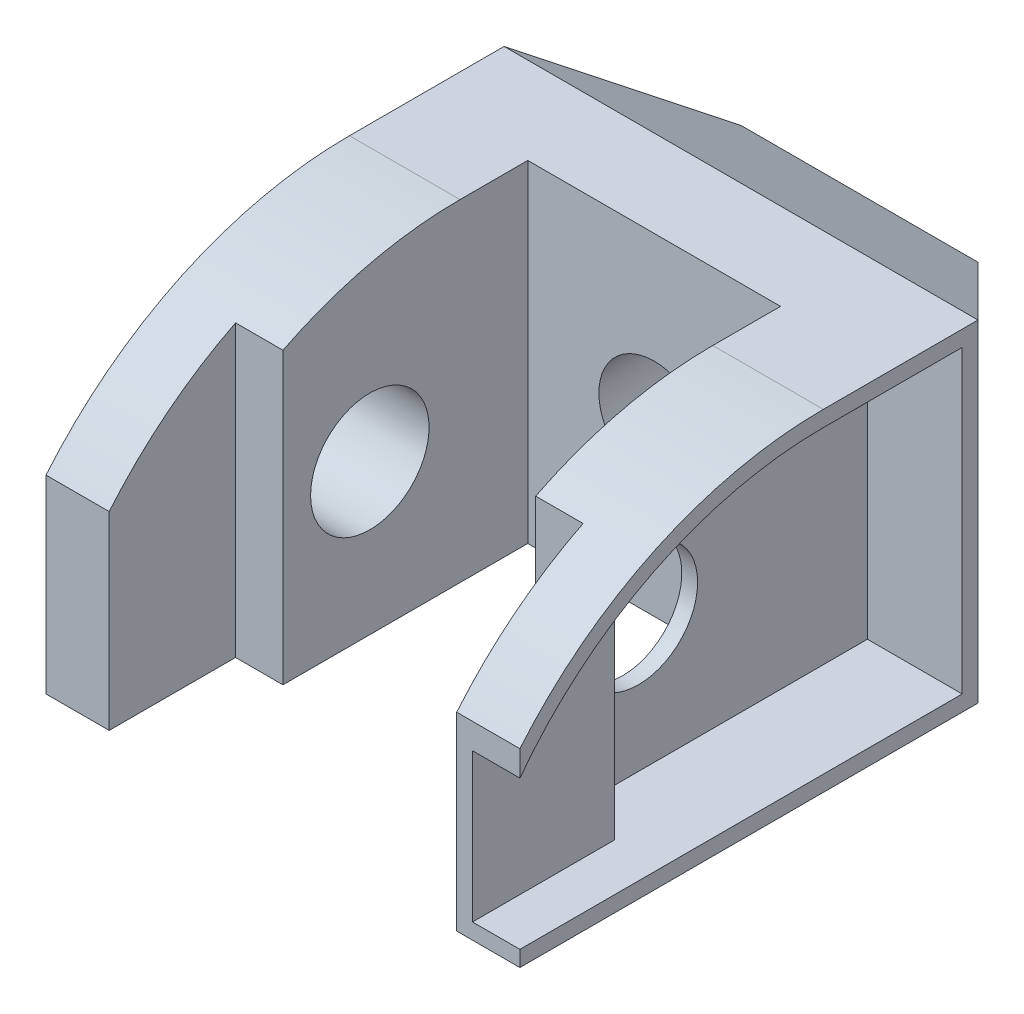
ISO-10303-21;
HEADER;
FILE_DESCRIPTION(('STEP AP214'),'2;1');
FILE_NAME('part.step','',(''),(''),'','','');
FILE_SCHEMA(('AUTOMOTIVE_DESIGN { 1 0 10303 214 1 1 1 1 }'));
ENDSEC;
DATA;
#1=APPLICATION_CONTEXT('core data for automotive mechanical design processes');
#2=APPLICATION_PROTOCOL_DEFINITION('international standard','automotive_design',2000,#1);
#3=PRODUCT_CONTEXT('',#1,'mechanical');
#4=PRODUCT('Part','Part','',(#3));
#5=PRODUCT_RELATED_PRODUCT_CATEGORY('part','',(#4));
#6=PRODUCT_DEFINITION_FORMATION('','',#4);
#7=PRODUCT_DEFINITION_CONTEXT('part definition',#1,'design');
#8=PRODUCT_DEFINITION('design','',#6,#7);
#9=PRODUCT_DEFINITION_SHAPE('','',#8);
#10=(LENGTH_UNIT() NAMED_UNIT(*) SI_UNIT(.MILLI.,.METRE.));
#11=(NAMED_UNIT(*) PLANE_ANGLE_UNIT() SI_UNIT($,.RADIAN.));
#12=(NAMED_UNIT(*) SI_UNIT($,.STERADIAN.) SOLID_ANGLE_UNIT());
#13=UNCERTAINTY_MEASURE_WITH_UNIT(LENGTH_MEASURE(1.E-05),#10,'distance_accuracy_value','');
#14=(GEOMETRIC_REPRESENTATION_CONTEXT(3) GLOBAL_UNCERTAINTY_ASSIGNED_CONTEXT((#13)) GLOBAL_UNIT_ASSIGNED_CONTEXT((#10,
#11,#12)) REPRESENTATION_CONTEXT('',''));
#15=CARTESIAN_POINT('',(0.,0.,0.));
#16=DIRECTION('',(0.,0.,1.));
#17=DIRECTION('',(1.,0.,0.));
#18=AXIS2_PLACEMENT_3D('',#15,#16,#17);
#19=CARTESIAN_POINT('',(60.,42.,0.));
#20=DIRECTION('',(0.,-0.866025403784442,0.499999999999994));
#21=DIRECTION('',(0.,-0.499999999999994,-0.866025403784442));
#22=AXIS2_PLACEMENT_3D('',#19,#20,#21);
#23=PLANE('',#22);
#24=DIRECTION('',(0.65465367070798,0.377964473009221,0.654653670707978));
#25=VECTOR('',#24,1.);
#26=CARTESIAN_POINT('',(47.6282085173653,34.8571428571431,-12.3717914826346));
#27=LINE('',#26,#25);
#28=CARTESIAN_POINT('',(60.,42.,0.));
#29=VERTEX_POINT('',#28);
#30=CARTESIAN_POINT('',(44.9999999999999,33.3397459621558,-15.));
#31=VERTEX_POINT('',#30);
#32=EDGE_CURVE('E47',#29,#31,#27,.F.);
#33=ORIENTED_EDGE('',*,*,#32,.T.);
#34=DIRECTION('',(-1.,0.,0.));
#35=VECTOR('',#34,1.);
#36=CARTESIAN_POINT('',(60.,33.3397459621558,-15.));
#37=LINE('',#36,#35);
#38=CARTESIAN_POINT('',(15.,33.3397459621558,-15.));
#39=VERTEX_POINT('',#38);
#40=EDGE_CURVE('E392',#31,#39,#37,.T.);
#41=ORIENTED_EDGE('',*,*,#40,.T.);
#42=DIRECTION('',(-0.654653670707977,0.377964473009222,0.65465367070798));
#43=VECTOR('',#42,1.);
#44=CARTESIAN_POINT('',(15.,33.3397459621558,-15.));
#45=LINE('',#44,#43);
#46=CARTESIAN_POINT('',(0.,42.,0.));
#47=VERTEX_POINT('',#46);
#48=EDGE_CURVE('E381',#39,#47,#45,.T.);
#49=ORIENTED_EDGE('',*,*,#48,.T.);
#50=DIRECTION('',(-1.,0.,0.));
#51=VECTOR('',#50,1.);
#52=CARTESIAN_POINT('',(60.,42.,0.));
#53=LINE('',#52,#51);
#54=EDGE_CURVE('E54',#29,#47,#53,.T.);
#55=ORIENTED_EDGE('',*,*,#54,.F.);
#56=EDGE_LOOP('',(#33,#41,#49,#55));
#57=FACE_BOUND('',#56,.T.);
#58=ADVANCED_FACE('F39',(#57),#23,.F.);
#59=CARTESIAN_POINT('',(60.,8.66025403784442,-15.));
#60=DIRECTION('',(0.,0.866025403784438,0.500000000000001));
#61=DIRECTION('',(0.,-0.500000000000001,0.866025403784438));
#62=AXIS2_PLACEMENT_3D('',#59,#60,#61);
#63=PLANE('',#62);
#64=DIRECTION('',(-0.654653670707978,0.377964473009228,-0.654653670707976));
#65=VECTOR('',#64,1.);
#66=CARTESIAN_POINT('',(61.9794866372216,-1.14285714285715,1.97948663722158));
#67=LINE('',#66,#65);
#68=CARTESIAN_POINT('',(44.9999999999999,8.66025403784442,-15.));
#69=VERTEX_POINT('',#68);
#70=CARTESIAN_POINT('',(60.,0.,0.));
#71=VERTEX_POINT('',#70);
#72=EDGE_CURVE('E11',#69,#71,#67,.F.);
#73=ORIENTED_EDGE('',*,*,#72,.T.);
#74=DIRECTION('',(-1.,0.,0.));
#75=VECTOR('',#74,1.);
#76=CARTESIAN_POINT('',(60.,0.,0.));
#77=LINE('',#76,#75);
#78=CARTESIAN_POINT('',(0.,0.,0.));
#79=VERTEX_POINT('',#78);
#80=EDGE_CURVE('E62',#71,#79,#77,.T.);
#81=ORIENTED_EDGE('',*,*,#80,.T.);
#82=DIRECTION('',(0.654653670707975,0.377964473009229,-0.654653670707978));
#83=VECTOR('',#82,1.);
#84=CARTESIAN_POINT('',(21.106590559699,12.1858957413175,-21.106590559699));
#85=LINE('',#84,#83);
#86=CARTESIAN_POINT('',(15.,8.66025403784441,-15.));
#87=VERTEX_POINT('',#86);
#88=EDGE_CURVE('E316',#79,#87,#85,.T.);
#89=ORIENTED_EDGE('',*,*,#88,.T.);
#90=DIRECTION('',(-1.,0.,0.));
#91=VECTOR('',#90,1.);
#92=CARTESIAN_POINT('',(60.,8.66025403784442,-15.));
#93=LINE('',#92,#91);
#94=EDGE_CURVE('E389',#69,#87,#93,.T.);
#95=ORIENTED_EDGE('',*,*,#94,.F.);
#96=EDGE_LOOP('',(#73,#81,#89,#95));
#97=FACE_BOUND('',#96,.T.);
#98=ADVANCED_FACE('F406',(#97),#63,.F.);
#99=CARTESIAN_POINT('',(60.,-8.,0.));
#100=DIRECTION('',(-0.707106781186546,0.,0.707106781186549));
#101=DIRECTION('',(0.,1.,0.));
#102=AXIS2_PLACEMENT_3D('',#99,#100,#101);
#103=PLANE('',#102);
#104=ORIENTED_EDGE('',*,*,#72,.F.);
#105=DIRECTION('',(0.,-1.,0.));
#106=VECTOR('',#105,1.);
#107=CARTESIAN_POINT('',(44.9999999999999,33.3397459621558,-15.));
#108=LINE('',#107,#106);
#109=EDGE_CURVE('E386',#31,#69,#108,.T.);
#110=ORIENTED_EDGE('',*,*,#109,.F.);
#111=ORIENTED_EDGE('',*,*,#32,.F.);
#112=DIRECTION('',(0.,1.,0.));
#113=VECTOR('',#112,1.);
#114=CARTESIAN_POINT('',(60.,-8.,0.));
#115=LINE('',#114,#113);
#116=EDGE_CURVE('E207',#71,#29,#115,.T.);
#117=ORIENTED_EDGE('',*,*,#116,.F.);
#118=EDGE_LOOP('',(#104,#110,#111,#117));
#119=FACE_BOUND('',#118,.T.);
#120=ADVANCED_FACE('F41',(#119),#103,.F.);
#121=CARTESIAN_POINT('',(60.,33.3397459621558,-15.));
#122=DIRECTION('',(0.,0.,1.));
#123=DIRECTION('',(0.,-1.,0.));
#124=AXIS2_PLACEMENT_3D('',#121,#122,#123);
#125=PLANE('',#124);
#126=CARTESIAN_POINT('',(30.,21.0000000000001,-15.));
#127=DIRECTION('',(0.,0.,-1.));
#128=DIRECTION('',(0.,1.,0.));
#129=AXIS2_PLACEMENT_3D('',#126,#127,#128);
#130=CIRCLE('',#129,7.);
#131=CARTESIAN_POINT('',(30.,28.0000000000001,-15.));
#132=VERTEX_POINT('',#131);
#133=EDGE_CURVE('E395',#132,#132,#130,.T.);
#134=ORIENTED_EDGE('',*,*,#133,.F.);
#135=EDGE_LOOP('',(#134));
#136=FACE_BOUND('',#135,.T.);
#137=ORIENTED_EDGE('',*,*,#94,.T.);
#138=DIRECTION('',(0.,1.,0.));
#139=VECTOR('',#138,1.);
#140=CARTESIAN_POINT('',(15.,33.3397459621558,-15.));
#141=LINE('',#140,#139);
#142=EDGE_CURVE('E383',#87,#39,#141,.T.);
#143=ORIENTED_EDGE('',*,*,#142,.T.);
#144=ORIENTED_EDGE('',*,*,#40,.F.);
#145=ORIENTED_EDGE('',*,*,#109,.T.);
#146=EDGE_LOOP('',(#137,#143,#144,#145));
#147=FACE_BOUND('',#146,.T.);
#148=ADVANCED_FACE('F402',(#136,#147),#125,.F.);
#149=CARTESIAN_POINT('',(15.,33.3397459621558,-15.));
#150=DIRECTION('',(-0.707106781186549,0.,-0.707106781186546));
#151=DIRECTION('',(0.,-1.,0.));
#152=AXIS2_PLACEMENT_3D('',#149,#150,#151);
#153=PLANE('',#152);
#154=ORIENTED_EDGE('',*,*,#88,.F.);
#155=DIRECTION('',(0.,-1.,0.));
#156=VECTOR('',#155,1.);
#157=CARTESIAN_POINT('',(0.,8.66025403784441,0.));
#158=LINE('',#157,#156);
#159=EDGE_CURVE('E322',#47,#79,#158,.T.);
#160=ORIENTED_EDGE('',*,*,#159,.F.);
#161=ORIENTED_EDGE('',*,*,#48,.F.);
#162=ORIENTED_EDGE('',*,*,#142,.F.);
#163=EDGE_LOOP('',(#154,#160,#161,#162));
#164=FACE_BOUND('',#163,.T.);
#165=ADVANCED_FACE('F459',(#164),#153,.T.);
#166=CARTESIAN_POINT('',(30.,21.0000000000001,58.));
#167=DIRECTION('',(0.,0.,-1.));
#168=DIRECTION('',(0.,1.,0.));
#169=AXIS2_PLACEMENT_3D('',#166,#167,#168);
#170=CYLINDRICAL_SURFACE('',#169,7.);
#171=ORIENTED_EDGE('',*,*,#133,.T.);
#172=EDGE_LOOP('',(#171));
#173=FACE_BOUND('',#172,.T.);
#174=CARTESIAN_POINT('',(30.,21.0000000000001,11.));
#175=DIRECTION('',(0.,0.,-1.));
#176=DIRECTION('',(-1.,0.,0.));
#177=AXIS2_PLACEMENT_3D('',#174,#175,#176);
#178=CIRCLE('',#177,7.);
#179=CARTESIAN_POINT('',(23.,21.0000000000001,11.));
#180=VERTEX_POINT('',#179);
#181=EDGE_CURVE('E313',#180,#180,#178,.T.);
#182=ORIENTED_EDGE('',*,*,#181,.F.);
#183=EDGE_LOOP('',(#182));
#184=FACE_BOUND('',#183,.T.);
#185=ADVANCED_FACE('F461',(#173,#184),#170,.F.);
#186=CARTESIAN_POINT('',(8.,60.,0.));
#187=DIRECTION('',(-1.,0.,0.));
#188=DIRECTION('',(0.,0.,1.));
#189=AXIS2_PLACEMENT_3D('',#186,#187,#188);
#190=PLANE('',#189);
#191=DIRECTION('',(0.,1.,0.));
#192=VECTOR('',#191,1.);
#193=CARTESIAN_POINT('',(8.,0.,58.));
#194=LINE('',#193,#192);
#195=CARTESIAN_POINT('',(8.,0.,58.));
#196=VERTEX_POINT('',#195);
#197=CARTESIAN_POINT('',(8.,24.,58.));
#198=VERTEX_POINT('',#197);
#199=EDGE_CURVE('E325',#196,#198,#194,.T.);
#200=ORIENTED_EDGE('',*,*,#199,.F.);
#201=DIRECTION('',(0.,0.,-1.));
#202=VECTOR('',#201,1.);
#203=CARTESIAN_POINT('',(8.,0.,0.));
#204=LINE('',#203,#202);
#205=CARTESIAN_POINT('',(8.,0.,42.));
#206=VERTEX_POINT('',#205);
#207=EDGE_CURVE('E361',#196,#206,#204,.T.);
#208=ORIENTED_EDGE('',*,*,#207,.T.);
#209=DIRECTION('',(0.,-1.,0.));
#210=VECTOR('',#209,1.);
#211=CARTESIAN_POINT('',(8.,60.,42.));
#212=LINE('',#211,#210);
#213=CARTESIAN_POINT('',(8.,36.6922795747443,42.));
#214=VERTEX_POINT('',#213);
#215=EDGE_CURVE('E359',#214,#206,#212,.T.);
#216=ORIENTED_EDGE('',*,*,#215,.F.);
#217=CARTESIAN_POINT('',(8.,-8.00000000000001,19.5812545754029));
#218=DIRECTION('',(-1.,0.,0.));
#219=DIRECTION('',(0.,0.,1.));
#220=AXIS2_PLACEMENT_3D('',#217,#218,#219);
#221=CIRCLE('',#220,50.);
#222=EDGE_CURVE('E348',#198,#214,#221,.T.);
#223=ORIENTED_EDGE('',*,*,#222,.F.);
#224=EDGE_LOOP('',(#200,#208,#216,#223));
#225=FACE_BOUND('',#224,.T.);
#226=ADVANCED_FACE('F467',(#225),#190,.F.);
#227=CARTESIAN_POINT('',(0.,60.,42.));
#228=DIRECTION('',(0.,0.,-1.));
#229=DIRECTION('',(-1.,0.,0.));
#230=AXIS2_PLACEMENT_3D('',#227,#228,#229);
#231=PLANE('',#230);
#232=ORIENTED_EDGE('',*,*,#215,.T.);
#233=DIRECTION('',(1.,0.,0.));
#234=VECTOR('',#233,1.);
#235=CARTESIAN_POINT('',(0.,0.,42.));
#236=LINE('',#235,#234);
#237=CARTESIAN_POINT('',(14.,0.,42.));
#238=VERTEX_POINT('',#237);
#239=EDGE_CURVE('E364',#206,#238,#236,.T.);
#240=ORIENTED_EDGE('',*,*,#239,.T.);
#241=DIRECTION('',(0.,-1.,0.));
#242=VECTOR('',#241,1.);
#243=CARTESIAN_POINT('',(14.,60.,42.));
#244=LINE('',#243,#242);
#245=CARTESIAN_POINT('',(14.,36.6922795747443,42.));
#246=VERTEX_POINT('',#245);
#247=EDGE_CURVE('E357',#246,#238,#244,.T.);
#248=ORIENTED_EDGE('',*,*,#247,.F.);
#249=DIRECTION('',(-1.,0.,0.));
#250=VECTOR('',#249,1.);
#251=CARTESIAN_POINT('',(60.,36.6922795747443,42.));
#252=LINE('',#251,#250);
#253=EDGE_CURVE('E321',#214,#246,#252,.F.);
#254=ORIENTED_EDGE('',*,*,#253,.F.);
#255=EDGE_LOOP('',(#232,#240,#248,#254));
#256=FACE_BOUND('',#255,.T.);
#257=ADVANCED_FACE('F442',(#256),#231,.F.);
#258=CARTESIAN_POINT('',(60.,19.,31.));
#259=DIRECTION('',(-1.,0.,0.));
#260=DIRECTION('',(0.,0.,1.));
#261=AXIS2_PLACEMENT_3D('',#258,#259,#260);
#262=CYLINDRICAL_SURFACE('',#261,7.5);
#263=CARTESIAN_POINT('',(14.,19.,31.));
#264=DIRECTION('',(-1.,0.,0.));
#265=DIRECTION('',(0.,0.,1.));
#266=AXIS2_PLACEMENT_3D('',#263,#264,#265);
#267=CIRCLE('',#266,7.5);
#268=CARTESIAN_POINT('',(14.,19.,38.5));
#269=VERTEX_POINT('',#268);
#270=EDGE_CURVE('E328',#269,#269,#267,.T.);
#271=ORIENTED_EDGE('',*,*,#270,.F.);
#272=EDGE_LOOP('',(#271));
#273=FACE_BOUND('',#272,.T.);
#274=CARTESIAN_POINT('',(0.,19.,31.));
#275=DIRECTION('',(1.,0.,0.));
#276=DIRECTION('',(0.,0.,-1.));
#277=AXIS2_PLACEMENT_3D('',#274,#275,#276);
#278=CIRCLE('',#277,7.5);
#279=CARTESIAN_POINT('',(0.,19.,23.5));
#280=VERTEX_POINT('',#279);
#281=EDGE_CURVE('E345',#280,#280,#278,.T.);
#282=ORIENTED_EDGE('',*,*,#281,.F.);
#283=EDGE_LOOP('',(#282));
#284=FACE_BOUND('',#283,.T.);
#285=ADVANCED_FACE('F707',(#273,#284),#262,.F.);
#286=CARTESIAN_POINT('',(60.,-8.00000000000001,19.5812545754029));
#287=DIRECTION('',(-1.,0.,0.));
#288=DIRECTION('',(0.,0.,1.));
#289=AXIS2_PLACEMENT_3D('',#286,#287,#288);
#290=CYLINDRICAL_SURFACE('',#289,50.);
#291=ORIENTED_EDGE('',*,*,#253,.T.);
#292=CARTESIAN_POINT('',(14.,-8.00000000000001,19.5812545754029));
#293=DIRECTION('',(-1.,0.,0.));
#294=DIRECTION('',(0.,0.,1.));
#295=AXIS2_PLACEMENT_3D('',#292,#293,#294);
#296=CIRCLE('',#295,50.);
#297=CARTESIAN_POINT('',(14.,42.,19.5812545754029));
#298=VERTEX_POINT('',#297);
#299=EDGE_CURVE('E332',#246,#298,#296,.T.);
#300=ORIENTED_EDGE('',*,*,#299,.T.);
#301=DIRECTION('',(-1.,0.,0.));
#302=VECTOR('',#301,1.);
#303=CARTESIAN_POINT('',(60.,42.,19.5812545754029));
#304=LINE('',#303,#302);
#305=CARTESIAN_POINT('',(0.,42.,19.5812545754029));
#306=VERTEX_POINT('',#305);
#307=EDGE_CURVE('E375',#298,#306,#304,.T.);
#308=ORIENTED_EDGE('',*,*,#307,.T.);
#309=CARTESIAN_POINT('',(0.,-8.00000000000001,19.5812545754029));
#310=DIRECTION('',(1.,0.,0.));
#311=DIRECTION('',(0.,0.,1.));
#312=AXIS2_PLACEMENT_3D('',#309,#310,#311);
#313=CIRCLE('',#312,50.);
#314=CARTESIAN_POINT('',(0.,24.,58.));
#315=VERTEX_POINT('',#314);
#316=EDGE_CURVE('E336',#306,#315,#313,.T.);
#317=ORIENTED_EDGE('',*,*,#316,.T.);
#318=DIRECTION('',(-1.,0.,0.));
#319=VECTOR('',#318,1.);
#320=CARTESIAN_POINT('',(60.,24.,58.));
#321=LINE('',#320,#319);
#322=EDGE_CURVE('E373',#198,#315,#321,.T.);
#323=ORIENTED_EDGE('',*,*,#322,.F.);
#324=ORIENTED_EDGE('',*,*,#222,.T.);
#325=EDGE_LOOP('',(#291,#300,#308,#317,#323,#324));
#326=FACE_BOUND('',#325,.T.);
#327=ADVANCED_FACE('F738',(#326),#290,.T.);
#328=CARTESIAN_POINT('',(60.,0.,58.));
#329=DIRECTION('',(0.,0.,-1.));
#330=DIRECTION('',(0.,1.,0.));
#331=AXIS2_PLACEMENT_3D('',#328,#329,#330);
#332=PLANE('',#331);
#333=DIRECTION('',(-1.,0.,0.));
#334=VECTOR('',#333,1.);
#335=CARTESIAN_POINT('',(60.,0.,58.));
#336=LINE('',#335,#334);
#337=CARTESIAN_POINT('',(0.,0.,58.));
#338=VERTEX_POINT('',#337);
#339=EDGE_CURVE('E337',#196,#338,#336,.T.);
#340=ORIENTED_EDGE('',*,*,#339,.F.);
#341=ORIENTED_EDGE('',*,*,#199,.T.);
#342=ORIENTED_EDGE('',*,*,#322,.T.);
#343=DIRECTION('',(0.,-1.,0.));
#344=VECTOR('',#343,1.);
#345=CARTESIAN_POINT('',(0.,0.,58.));
#346=LINE('',#345,#344);
#347=EDGE_CURVE('E333',#315,#338,#346,.T.);
#348=ORIENTED_EDGE('',*,*,#347,.T.);
#349=EDGE_LOOP('',(#340,#341,#342,#348));
#350=FACE_BOUND('',#349,.T.);
#351=ADVANCED_FACE('F448',(#350),#332,.F.);
#352=CARTESIAN_POINT('',(60.,0.,0.));
#353=DIRECTION('',(0.,1.,0.));
#354=DIRECTION('',(0.,0.,1.));
#355=AXIS2_PLACEMENT_3D('',#352,#353,#354);
#356=PLANE('',#355);
#357=ORIENTED_EDGE('',*,*,#80,.F.);
#358=DIRECTION('',(0.,0.,-1.));
#359=VECTOR('',#358,1.);
#360=CARTESIAN_POINT('',(60.,0.,0.));
#361=LINE('',#360,#359);
#362=CARTESIAN_POINT('',(60.,0.,58.));
#363=VERTEX_POINT('',#362);
#364=EDGE_CURVE('E281',#363,#71,#361,.T.);
#365=ORIENTED_EDGE('',*,*,#364,.F.);
#366=DIRECTION('',(-1.,0.,0.));
#367=VECTOR('',#366,1.);
#368=CARTESIAN_POINT('',(60.,0.,58.));
#369=LINE('',#368,#367);
#370=CARTESIAN_POINT('',(52.,0.,58.));
#371=VERTEX_POINT('',#370);
#372=EDGE_CURVE('E305',#363,#371,#369,.T.);
#373=ORIENTED_EDGE('',*,*,#372,.T.);
#374=DIRECTION('',(0.,0.,-1.));
#375=VECTOR('',#374,1.);
#376=CARTESIAN_POINT('',(52.,0.,0.));
#377=LINE('',#376,#375);
#378=CARTESIAN_POINT('',(52.,0.,42.));
#379=VERTEX_POINT('',#378);
#380=EDGE_CURVE('E299',#371,#379,#377,.T.);
#381=ORIENTED_EDGE('',*,*,#380,.T.);
#382=DIRECTION('',(-1.,0.,0.));
#383=VECTOR('',#382,1.);
#384=CARTESIAN_POINT('',(0.,0.,42.));
#385=LINE('',#384,#383);
#386=CARTESIAN_POINT('',(46.,0.,42.));
#387=VERTEX_POINT('',#386);
#388=EDGE_CURVE('E296',#379,#387,#385,.T.);
#389=ORIENTED_EDGE('',*,*,#388,.T.);
#390=DIRECTION('',(0.,0.,-1.));
#391=VECTOR('',#390,1.);
#392=CARTESIAN_POINT('',(46.,0.,0.));
#393=LINE('',#392,#391);
#394=CARTESIAN_POINT('',(46.,0.,11.));
#395=VERTEX_POINT('',#394);
#396=EDGE_CURVE('E293',#387,#395,#393,.T.);
#397=ORIENTED_EDGE('',*,*,#396,.T.);
#398=DIRECTION('',(1.,0.,0.));
#399=VECTOR('',#398,1.);
#400=CARTESIAN_POINT('',(0.,0.,11.));
#401=LINE('',#400,#399);
#402=CARTESIAN_POINT('',(14.,0.,11.));
#403=VERTEX_POINT('',#402);
#404=EDGE_CURVE('E317',#403,#395,#401,.T.);
#405=ORIENTED_EDGE('',*,*,#404,.F.);
#406=DIRECTION('',(0.,0.,-1.));
#407=VECTOR('',#406,1.);
#408=CARTESIAN_POINT('',(14.,0.,0.));
#409=LINE('',#408,#407);
#410=EDGE_CURVE('E367',#238,#403,#409,.T.);
#411=ORIENTED_EDGE('',*,*,#410,.F.);
#412=ORIENTED_EDGE('',*,*,#239,.F.);
#413=ORIENTED_EDGE('',*,*,#207,.F.);
#414=ORIENTED_EDGE('',*,*,#339,.T.);
#415=DIRECTION('',(0.,0.,-1.));
#416=VECTOR('',#415,1.);
#417=CARTESIAN_POINT('',(0.,0.,0.));
#418=LINE('',#417,#416);
#419=EDGE_CURVE('E343',#338,#79,#418,.T.);
#420=ORIENTED_EDGE('',*,*,#419,.T.);
#421=EDGE_LOOP('',(#357,#365,#373,#381,#389,#397,#405,#411,#412,#413,#414,#420));
#422=FACE_BOUND('',#421,.T.);
#423=ADVANCED_FACE('F411',(#422),#356,.F.);
#424=CARTESIAN_POINT('',(60.,42.,0.));
#425=DIRECTION('',(0.,-1.,0.));
#426=DIRECTION('',(0.,0.,-1.));
#427=AXIS2_PLACEMENT_3D('',#424,#425,#426);
#428=PLANE('',#427);
#429=DIRECTION('',(1.,0.,0.));
#430=VECTOR('',#429,1.);
#431=CARTESIAN_POINT('',(60.,42.,11.));
#432=LINE('',#431,#430);
#433=CARTESIAN_POINT('',(14.,42.,11.));
#434=VERTEX_POINT('',#433);
#435=CARTESIAN_POINT('',(46.,42.,11.));
#436=VERTEX_POINT('',#435);
#437=EDGE_CURVE('E318',#434,#436,#432,.T.);
#438=ORIENTED_EDGE('',*,*,#437,.T.);
#439=DIRECTION('',(0.,0.,-1.));
#440=VECTOR('',#439,1.);
#441=CARTESIAN_POINT('',(46.,42.,0.));
#442=LINE('',#441,#440);
#443=CARTESIAN_POINT('',(46.,42.,19.5812545754029));
#444=VERTEX_POINT('',#443);
#445=EDGE_CURVE('E286',#444,#436,#442,.T.);
#446=ORIENTED_EDGE('',*,*,#445,.F.);
#447=DIRECTION('',(-1.,0.,0.));
#448=VECTOR('',#447,1.);
#449=CARTESIAN_POINT('',(60.,42.,19.5812545754029));
#450=LINE('',#449,#448);
#451=CARTESIAN_POINT('',(60.,42.,19.5812545754029));
#452=VERTEX_POINT('',#451);
#453=EDGE_CURVE('E268',#452,#444,#450,.T.);
#454=ORIENTED_EDGE('',*,*,#453,.F.);
#455=DIRECTION('',(0.,0.,1.));
#456=VECTOR('',#455,1.);
#457=CARTESIAN_POINT('',(60.,42.,0.));
#458=LINE('',#457,#456);
#459=EDGE_CURVE('E279',#29,#452,#458,.T.);
#460=ORIENTED_EDGE('',*,*,#459,.F.);
#461=ORIENTED_EDGE('',*,*,#54,.T.);
#462=DIRECTION('',(0.,0.,1.));
#463=VECTOR('',#462,1.);
#464=CARTESIAN_POINT('',(0.,42.,0.));
#465=LINE('',#464,#463);
#466=EDGE_CURVE('E340',#47,#306,#465,.T.);
#467=ORIENTED_EDGE('',*,*,#466,.T.);
#468=ORIENTED_EDGE('',*,*,#307,.F.);
#469=DIRECTION('',(0.,0.,-1.));
#470=VECTOR('',#469,1.);
#471=CARTESIAN_POINT('',(14.,42.,0.));
#472=LINE('',#471,#470);
#473=EDGE_CURVE('E351',#298,#434,#472,.T.);
#474=ORIENTED_EDGE('',*,*,#473,.T.);
#475=EDGE_LOOP('',(#438,#446,#454,#460,#461,#467,#468,#474));
#476=FACE_BOUND('',#475,.T.);
#477=ADVANCED_FACE('F497',(#476),#428,.F.);
#478=CARTESIAN_POINT('',(0.,-8.00000000000001,19.5812545754029));
#479=DIRECTION('',(-1.,0.,0.));
#480=DIRECTION('',(0.,0.,1.));
#481=AXIS2_PLACEMENT_3D('',#478,#479,#480);
#482=PLANE('',#481);
#483=ORIENTED_EDGE('',*,*,#466,.F.);
#484=ORIENTED_EDGE('',*,*,#159,.T.);
#485=ORIENTED_EDGE('',*,*,#419,.F.);
#486=ORIENTED_EDGE('',*,*,#347,.F.);
#487=ORIENTED_EDGE('',*,*,#316,.F.);
#488=EDGE_LOOP('',(#483,#484,#485,#486,#487));
#489=FACE_BOUND('',#488,.T.);
#490=ORIENTED_EDGE('',*,*,#281,.T.);
#491=EDGE_LOOP('',(#490));
#492=FACE_BOUND('',#491,.T.);
#493=ADVANCED_FACE('F455',(#489,#492),#482,.T.);
#494=CARTESIAN_POINT('',(14.,60.,0.));
#495=DIRECTION('',(-1.,0.,0.));
#496=DIRECTION('',(0.,0.,1.));
#497=AXIS2_PLACEMENT_3D('',#494,#495,#496);
#498=PLANE('',#497);
#499=ORIENTED_EDGE('',*,*,#270,.T.);
#500=EDGE_LOOP('',(#499));
#501=FACE_BOUND('',#500,.T.);
#502=ORIENTED_EDGE('',*,*,#299,.F.);
#503=ORIENTED_EDGE('',*,*,#247,.T.);
#504=ORIENTED_EDGE('',*,*,#410,.T.);
#505=DIRECTION('',(0.,-1.,0.));
#506=VECTOR('',#505,1.);
#507=CARTESIAN_POINT('',(14.,60.,11.));
#508=LINE('',#507,#506);
#509=EDGE_CURVE('E331',#434,#403,#508,.T.);
#510=ORIENTED_EDGE('',*,*,#509,.F.);
#511=ORIENTED_EDGE('',*,*,#473,.F.);
#512=EDGE_LOOP('',(#502,#503,#504,#510,#511));
#513=FACE_BOUND('',#512,.T.);
#514=ADVANCED_FACE('F439',(#501,#513),#498,.F.);
#515=CARTESIAN_POINT('',(0.,60.,11.));
#516=DIRECTION('',(0.,0.,-1.));
#517=DIRECTION('',(-1.,0.,0.));
#518=AXIS2_PLACEMENT_3D('',#515,#516,#517);
#519=PLANE('',#518);
#520=ORIENTED_EDGE('',*,*,#181,.T.);
#521=EDGE_LOOP('',(#520));
#522=FACE_BOUND('',#521,.T.);
#523=ORIENTED_EDGE('',*,*,#509,.T.);
#524=ORIENTED_EDGE('',*,*,#404,.T.);
#525=DIRECTION('',(0.,-1.,0.));
#526=VECTOR('',#525,1.);
#527=CARTESIAN_POINT('',(46.,60.,11.));
#528=LINE('',#527,#526);
#529=EDGE_CURVE('E302',#436,#395,#528,.T.);
#530=ORIENTED_EDGE('',*,*,#529,.F.);
#531=ORIENTED_EDGE('',*,*,#437,.F.);
#532=EDGE_LOOP('',(#523,#524,#530,#531));
#533=FACE_BOUND('',#532,.T.);
#534=ADVANCED_FACE('F436',(#522,#533),#519,.F.);
#535=CARTESIAN_POINT('',(46.,0.,0.));
#536=DIRECTION('',(-1.,0.,0.));
#537=DIRECTION('',(0.,0.,1.));
#538=AXIS2_PLACEMENT_3D('',#535,#536,#537);
#539=PLANE('',#538);
#540=CARTESIAN_POINT('',(46.,19.,31.));
#541=DIRECTION('',(-1.,0.,0.));
#542=DIRECTION('',(0.,0.,1.));
#543=AXIS2_PLACEMENT_3D('',#540,#541,#542);
#544=CIRCLE('',#543,7.5);
#545=CARTESIAN_POINT('',(46.,19.,38.5));
#546=VERTEX_POINT('',#545);
#547=EDGE_CURVE('E269',#546,#546,#544,.T.);
#548=ORIENTED_EDGE('',*,*,#547,.F.);
#549=EDGE_LOOP('',(#548));
#550=FACE_BOUND('',#549,.T.);
#551=ORIENTED_EDGE('',*,*,#529,.T.);
#552=ORIENTED_EDGE('',*,*,#396,.F.);
#553=DIRECTION('',(0.,-1.,0.));
#554=VECTOR('',#553,1.);
#555=CARTESIAN_POINT('',(46.,60.,42.));
#556=LINE('',#555,#554);
#557=CARTESIAN_POINT('',(46.,36.6922795747443,42.));
#558=VERTEX_POINT('',#557);
#559=EDGE_CURVE('E291',#558,#387,#556,.T.);
#560=ORIENTED_EDGE('',*,*,#559,.F.);
#561=CARTESIAN_POINT('',(46.,-8.00000000000001,19.5812545754029));
#562=DIRECTION('',(-1.,0.,0.));
#563=DIRECTION('',(0.,0.,1.));
#564=AXIS2_PLACEMENT_3D('',#561,#562,#563);
#565=CIRCLE('',#564,50.);
#566=EDGE_CURVE('E273',#558,#444,#565,.T.);
#567=ORIENTED_EDGE('',*,*,#566,.T.);
#568=ORIENTED_EDGE('',*,*,#445,.T.);
#569=EDGE_LOOP('',(#551,#552,#560,#567,#568));
#570=FACE_BOUND('',#569,.T.);
#571=ADVANCED_FACE('F430',(#550,#570),#539,.T.);
#572=CARTESIAN_POINT('',(60.,19.,31.));
#573=DIRECTION('',(-1.,0.,0.));
#574=DIRECTION('',(0.,0.,1.));
#575=AXIS2_PLACEMENT_3D('',#572,#573,#574);
#576=CYLINDRICAL_SURFACE('',#575,7.5);
#577=ORIENTED_EDGE('',*,*,#547,.T.);
#578=EDGE_LOOP('',(#577));
#579=FACE_BOUND('',#578,.T.);
#580=CARTESIAN_POINT('',(48.,19.,31.));
#581=DIRECTION('',(1.,0.,0.));
#582=DIRECTION('',(0.,0.,-1.));
#583=AXIS2_PLACEMENT_3D('',#580,#581,#582);
#584=CIRCLE('',#583,7.5);
#585=CARTESIAN_POINT('',(48.,19.,23.5));
#586=VERTEX_POINT('',#585);
#587=EDGE_CURVE('E223',#586,#586,#584,.T.);
#588=ORIENTED_EDGE('',*,*,#587,.T.);
#589=EDGE_LOOP('',(#588));
#590=FACE_BOUND('',#589,.T.);
#591=ADVANCED_FACE('F524',(#579,#590),#576,.F.);
#592=CARTESIAN_POINT('',(60.,-8.00000000000001,19.5812545754029));
#593=DIRECTION('',(-1.,0.,0.));
#594=DIRECTION('',(0.,0.,1.));
#595=AXIS2_PLACEMENT_3D('',#592,#593,#594);
#596=PLANE('',#595);
#597=DIRECTION('',(0.,0.,-1.));
#598=VECTOR('',#597,1.);
#599=CARTESIAN_POINT('',(60.,2.,19.5812545754029));
#600=LINE('',#599,#598);
#601=CARTESIAN_POINT('',(60.,1.99999999999999,58.));
#602=VERTEX_POINT('',#601);
#603=CARTESIAN_POINT('',(60.,2.,2.));
#604=VERTEX_POINT('',#603);
#605=EDGE_CURVE('E253',#602,#604,#600,.T.);
#606=ORIENTED_EDGE('',*,*,#605,.F.);
#607=DIRECTION('',(0.,-1.,0.));
#608=VECTOR('',#607,1.);
#609=CARTESIAN_POINT('',(60.,0.,58.));
#610=LINE('',#609,#608);
#611=EDGE_CURVE('E220',#602,#363,#610,.T.);
#612=ORIENTED_EDGE('',*,*,#611,.T.);
#613=ORIENTED_EDGE('',*,*,#364,.T.);
#614=ORIENTED_EDGE('',*,*,#116,.T.);
#615=ORIENTED_EDGE('',*,*,#459,.T.);
#616=CARTESIAN_POINT('',(60.,-8.00000000000001,19.5812545754029));
#617=DIRECTION('',(1.,0.,0.));
#618=DIRECTION('',(0.,0.,1.));
#619=AXIS2_PLACEMENT_3D('',#616,#617,#618);
#620=CIRCLE('',#619,50.);
#621=CARTESIAN_POINT('',(60.,24.,58.));
#622=VERTEX_POINT('',#621);
#623=EDGE_CURVE('E277',#452,#622,#620,.T.);
#624=ORIENTED_EDGE('',*,*,#623,.T.);
#625=CARTESIAN_POINT('',(60.,20.7749891398763,58.));
#626=VERTEX_POINT('',#625);
#627=EDGE_CURVE('E274',#622,#626,#610,.T.);
#628=ORIENTED_EDGE('',*,*,#627,.T.);
#629=CARTESIAN_POINT('',(60.,-8.00000000000001,19.5812545754029));
#630=DIRECTION('',(-1.,0.,0.));
#631=DIRECTION('',(0.,0.,1.));
#632=AXIS2_PLACEMENT_3D('',#629,#630,#631);
#633=CIRCLE('',#632,48.);
#634=CARTESIAN_POINT('',(60.,40.,19.5812545754029));
#635=VERTEX_POINT('',#634);
#636=EDGE_CURVE('E257',#635,#626,#633,.F.);
#637=ORIENTED_EDGE('',*,*,#636,.F.);
#638=DIRECTION('',(0.,0.,1.));
#639=VECTOR('',#638,1.);
#640=CARTESIAN_POINT('',(60.,40.,19.5812545754029));
#641=LINE('',#640,#639);
#642=CARTESIAN_POINT('',(60.,40.,2.00000000000001));
#643=VERTEX_POINT('',#642);
#644=EDGE_CURVE('E260',#643,#635,#641,.T.);
#645=ORIENTED_EDGE('',*,*,#644,.F.);
#646=DIRECTION('',(0.,1.,0.));
#647=VECTOR('',#646,1.);
#648=CARTESIAN_POINT('',(60.,0.,2.));
#649=LINE('',#648,#647);
#650=EDGE_CURVE('E232',#604,#643,#649,.T.);
#651=ORIENTED_EDGE('',*,*,#650,.F.);
#652=EDGE_LOOP('',(#606,#612,#613,#614,#615,#624,#628,#637,#645,#651));
#653=FACE_BOUND('',#652,.T.);
#654=ADVANCED_FACE('F409',(#653),#596,.F.);
#655=CARTESIAN_POINT('',(0.,60.,42.));
#656=DIRECTION('',(0.,0.,1.));
#657=DIRECTION('',(1.,0.,0.));
#658=AXIS2_PLACEMENT_3D('',#655,#656,#657);
#659=PLANE('',#658);
#660=DIRECTION('',(-1.,0.,0.));
#661=VECTOR('',#660,1.);
#662=CARTESIAN_POINT('',(60.,36.6922795747443,42.));
#663=LINE('',#662,#661);
#664=CARTESIAN_POINT('',(52.,36.6922795747443,42.));
#665=VERTEX_POINT('',#664);
#666=EDGE_CURVE('E264',#665,#558,#663,.T.);
#667=ORIENTED_EDGE('',*,*,#666,.T.);
#668=ORIENTED_EDGE('',*,*,#559,.T.);
#669=ORIENTED_EDGE('',*,*,#388,.F.);
#670=DIRECTION('',(0.,-1.,0.));
#671=VECTOR('',#670,1.);
#672=CARTESIAN_POINT('',(52.,60.,42.));
#673=LINE('',#672,#671);
#674=EDGE_CURVE('E272',#665,#379,#673,.T.);
#675=ORIENTED_EDGE('',*,*,#674,.F.);
#676=EDGE_LOOP('',(#667,#668,#669,#675));
#677=FACE_BOUND('',#676,.T.);
#678=ADVANCED_FACE('F426',(#677),#659,.T.);
#679=CARTESIAN_POINT('',(52.,60.,0.));
#680=DIRECTION('',(-1.,0.,0.));
#681=DIRECTION('',(0.,0.,1.));
#682=AXIS2_PLACEMENT_3D('',#679,#680,#681);
#683=PLANE('',#682);
#684=CARTESIAN_POINT('',(52.,-8.00000000000001,19.5812545754029));
#685=DIRECTION('',(-1.,0.,0.));
#686=DIRECTION('',(0.,0.,1.));
#687=AXIS2_PLACEMENT_3D('',#684,#685,#686);
#688=CIRCLE('',#687,50.);
#689=CARTESIAN_POINT('',(52.,24.,58.));
#690=VERTEX_POINT('',#689);
#691=EDGE_CURVE('E284',#690,#665,#688,.T.);
#692=ORIENTED_EDGE('',*,*,#691,.T.);
#693=ORIENTED_EDGE('',*,*,#674,.T.);
#694=ORIENTED_EDGE('',*,*,#380,.F.);
#695=DIRECTION('',(0.,1.,0.));
#696=VECTOR('',#695,1.);
#697=CARTESIAN_POINT('',(52.,0.,58.));
#698=LINE('',#697,#696);
#699=EDGE_CURVE('E266',#371,#690,#698,.T.);
#700=ORIENTED_EDGE('',*,*,#699,.T.);
#701=EDGE_LOOP('',(#692,#693,#694,#700));
#702=FACE_BOUND('',#701,.T.);
#703=ADVANCED_FACE('F417',(#702),#683,.T.);
#704=CARTESIAN_POINT('',(60.,0.,58.));
#705=DIRECTION('',(0.,0.,-1.));
#706=DIRECTION('',(0.,1.,0.));
#707=AXIS2_PLACEMENT_3D('',#704,#705,#706);
#708=PLANE('',#707);
#709=ORIENTED_EDGE('',*,*,#611,.F.);
#710=DIRECTION('',(1.,0.,0.));
#711=VECTOR('',#710,1.);
#712=CARTESIAN_POINT('',(32.6383734495085,1.99999999999999,58.));
#713=LINE('',#712,#711);
#714=CARTESIAN_POINT('',(54.,1.99999999999999,58.));
#715=VERTEX_POINT('',#714);
#716=EDGE_CURVE('E202',#715,#602,#713,.T.);
#717=ORIENTED_EDGE('',*,*,#716,.F.);
#718=DIRECTION('',(0.,-1.,0.));
#719=VECTOR('',#718,1.);
#720=CARTESIAN_POINT('',(54.,0.,58.));
#721=LINE('',#720,#719);
#722=CARTESIAN_POINT('',(54.,20.7749891398763,58.));
#723=VERTEX_POINT('',#722);
#724=EDGE_CURVE('E210',#723,#715,#721,.T.);
#725=ORIENTED_EDGE('',*,*,#724,.F.);
#726=DIRECTION('',(1.,0.,0.));
#727=VECTOR('',#726,1.);
#728=CARTESIAN_POINT('',(32.6383734495085,20.7749891398763,58.));
#729=LINE('',#728,#727);
#730=EDGE_CURVE('E221',#723,#626,#729,.T.);
#731=ORIENTED_EDGE('',*,*,#730,.T.);
#732=ORIENTED_EDGE('',*,*,#627,.F.);
#733=DIRECTION('',(-1.,0.,0.));
#734=VECTOR('',#733,1.);
#735=CARTESIAN_POINT('',(60.,24.,58.));
#736=LINE('',#735,#734);
#737=EDGE_CURVE('E308',#622,#690,#736,.T.);
#738=ORIENTED_EDGE('',*,*,#737,.T.);
#739=ORIENTED_EDGE('',*,*,#699,.F.);
#740=ORIENTED_EDGE('',*,*,#372,.F.);
#741=EDGE_LOOP('',(#709,#717,#725,#731,#732,#738,#739,#740));
#742=FACE_BOUND('',#741,.T.);
#743=ADVANCED_FACE('F218',(#742),#708,.F.);
#744=CARTESIAN_POINT('',(60.,-8.00000000000001,19.5812545754029));
#745=DIRECTION('',(-1.,0.,0.));
#746=DIRECTION('',(0.,0.,1.));
#747=AXIS2_PLACEMENT_3D('',#744,#745,#746);
#748=CYLINDRICAL_SURFACE('',#747,50.);
#749=ORIENTED_EDGE('',*,*,#691,.F.);
#750=ORIENTED_EDGE('',*,*,#737,.F.);
#751=ORIENTED_EDGE('',*,*,#623,.F.);
#752=ORIENTED_EDGE('',*,*,#453,.T.);
#753=ORIENTED_EDGE('',*,*,#566,.F.);
#754=ORIENTED_EDGE('',*,*,#666,.F.);
#755=EDGE_LOOP('',(#749,#750,#751,#752,#753,#754));
#756=FACE_BOUND('',#755,.T.);
#757=ADVANCED_FACE('F421',(#756),#748,.T.);
#758=CARTESIAN_POINT('',(0.,60.,39.9999999999999));
#759=DIRECTION('',(0.,0.,1.));
#760=DIRECTION('',(1.,0.,0.));
#761=AXIS2_PLACEMENT_3D('',#758,#759,#760);
#762=PLANE('',#761);
#763=DIRECTION('',(-1.,0.,0.));
#764=VECTOR('',#763,1.);
#765=CARTESIAN_POINT('',(54.,35.440474620859,40.));
#766=LINE('',#765,#764);
#767=CARTESIAN_POINT('',(54.,35.440474620859,40.));
#768=VERTEX_POINT('',#767);
#769=CARTESIAN_POINT('',(48.,35.440474620859,40.));
#770=VERTEX_POINT('',#769);
#771=EDGE_CURVE('E239',#768,#770,#766,.T.);
#772=ORIENTED_EDGE('',*,*,#771,.F.);
#773=DIRECTION('',(0.,-1.,0.));
#774=VECTOR('',#773,1.);
#775=CARTESIAN_POINT('',(54.,60.,40.));
#776=LINE('',#775,#774);
#777=CARTESIAN_POINT('',(54.,1.99999999999999,40.));
#778=VERTEX_POINT('',#777);
#779=EDGE_CURVE('E244',#768,#778,#776,.T.);
#780=ORIENTED_EDGE('',*,*,#779,.T.);
#781=DIRECTION('',(-1.,0.,0.));
#782=VECTOR('',#781,1.);
#783=CARTESIAN_POINT('',(0.,1.99999999999999,39.9999999999999));
#784=LINE('',#783,#782);
#785=CARTESIAN_POINT('',(48.,1.99999999999999,40.));
#786=VERTEX_POINT('',#785);
#787=EDGE_CURVE('E205',#778,#786,#784,.T.);
#788=ORIENTED_EDGE('',*,*,#787,.T.);
#789=DIRECTION('',(0.,-1.,0.));
#790=VECTOR('',#789,1.);
#791=CARTESIAN_POINT('',(48.,60.,40.));
#792=LINE('',#791,#790);
#793=EDGE_CURVE('E242',#770,#786,#792,.T.);
#794=ORIENTED_EDGE('',*,*,#793,.F.);
#795=EDGE_LOOP('',(#772,#780,#788,#794));
#796=FACE_BOUND('',#795,.T.);
#797=ADVANCED_FACE('F569',(#796),#762,.F.);
#798=CARTESIAN_POINT('',(0.,0.,2.));
#799=DIRECTION('',(0.,0.,-1.));
#800=DIRECTION('',(0.,1.,0.));
#801=AXIS2_PLACEMENT_3D('',#798,#799,#800);
#802=PLANE('',#801);
#803=ORIENTED_EDGE('',*,*,#650,.T.);
#804=DIRECTION('',(-1.,0.,0.));
#805=VECTOR('',#804,1.);
#806=CARTESIAN_POINT('',(0.,40.,2.00000000000001));
#807=LINE('',#806,#805);
#808=CARTESIAN_POINT('',(48.,40.,2.00000000000001));
#809=VERTEX_POINT('',#808);
#810=EDGE_CURVE('E235',#643,#809,#807,.T.);
#811=ORIENTED_EDGE('',*,*,#810,.T.);
#812=DIRECTION('',(0.,1.,0.));
#813=VECTOR('',#812,1.);
#814=CARTESIAN_POINT('',(48.,0.,2.));
#815=LINE('',#814,#813);
#816=CARTESIAN_POINT('',(48.,2.,2.));
#817=VERTEX_POINT('',#816);
#818=EDGE_CURVE('E228',#817,#809,#815,.T.);
#819=ORIENTED_EDGE('',*,*,#818,.F.);
#820=DIRECTION('',(-1.,0.,0.));
#821=VECTOR('',#820,1.);
#822=CARTESIAN_POINT('',(60.,2.,2.));
#823=LINE('',#822,#821);
#824=EDGE_CURVE('E229',#604,#817,#823,.T.);
#825=ORIENTED_EDGE('',*,*,#824,.F.);
#826=EDGE_LOOP('',(#803,#811,#819,#825));
#827=FACE_BOUND('',#826,.T.);
#828=ADVANCED_FACE('F577',(#827),#802,.F.);
#829=CARTESIAN_POINT('',(48.,0.,0.));
#830=DIRECTION('',(-1.,0.,0.));
#831=DIRECTION('',(0.,0.,1.));
#832=AXIS2_PLACEMENT_3D('',#829,#830,#831);
#833=PLANE('',#832);
#834=ORIENTED_EDGE('',*,*,#793,.T.);
#835=DIRECTION('',(0.,0.,-1.));
#836=VECTOR('',#835,1.);
#837=CARTESIAN_POINT('',(48.,2.,0.));
#838=LINE('',#837,#836);
#839=EDGE_CURVE('E240',#786,#817,#838,.T.);
#840=ORIENTED_EDGE('',*,*,#839,.T.);
#841=ORIENTED_EDGE('',*,*,#818,.T.);
#842=DIRECTION('',(0.,0.,-1.));
#843=VECTOR('',#842,1.);
#844=CARTESIAN_POINT('',(48.,40.,0.));
#845=LINE('',#844,#843);
#846=CARTESIAN_POINT('',(48.,40.,19.5812545754029));
#847=VERTEX_POINT('',#846);
#848=EDGE_CURVE('E247',#847,#809,#845,.T.);
#849=ORIENTED_EDGE('',*,*,#848,.F.);
#850=CARTESIAN_POINT('',(48.,-8.00000000000001,19.5812545754029));
#851=DIRECTION('',(-1.,0.,0.));
#852=DIRECTION('',(0.,0.,1.));
#853=AXIS2_PLACEMENT_3D('',#850,#851,#852);
#854=CIRCLE('',#853,48.);
#855=EDGE_CURVE('E245',#770,#847,#854,.T.);
#856=ORIENTED_EDGE('',*,*,#855,.F.);
#857=EDGE_LOOP('',(#834,#840,#841,#849,#856));
#858=FACE_BOUND('',#857,.T.);
#859=ORIENTED_EDGE('',*,*,#587,.F.);
#860=EDGE_LOOP('',(#859));
#861=FACE_BOUND('',#860,.T.);
#862=ADVANCED_FACE('F586',(#858,#861),#833,.F.);
#863=CARTESIAN_POINT('',(54.,60.,0.));
#864=DIRECTION('',(-1.,0.,0.));
#865=DIRECTION('',(0.,0.,1.));
#866=AXIS2_PLACEMENT_3D('',#863,#864,#865);
#867=PLANE('',#866);
#868=ORIENTED_EDGE('',*,*,#779,.F.);
#869=CARTESIAN_POINT('',(54.,-8.00000000000001,19.5812545754029));
#870=DIRECTION('',(-1.,0.,0.));
#871=DIRECTION('',(0.,0.,1.));
#872=AXIS2_PLACEMENT_3D('',#869,#870,#871);
#873=CIRCLE('',#872,48.);
#874=EDGE_CURVE('E213',#723,#768,#873,.T.);
#875=ORIENTED_EDGE('',*,*,#874,.F.);
#876=ORIENTED_EDGE('',*,*,#724,.T.);
#877=DIRECTION('',(0.,0.,-1.));
#878=VECTOR('',#877,1.);
#879=CARTESIAN_POINT('',(54.,2.,0.));
#880=LINE('',#879,#878);
#881=EDGE_CURVE('E197',#715,#778,#880,.T.);
#882=ORIENTED_EDGE('',*,*,#881,.T.);
#883=EDGE_LOOP('',(#868,#875,#876,#882));
#884=FACE_BOUND('',#883,.T.);
#885=ADVANCED_FACE('F211',(#884),#867,.F.);
#886=CARTESIAN_POINT('',(60.,-8.00000000000001,19.5812545754029));
#887=DIRECTION('',(-1.,0.,0.));
#888=DIRECTION('',(0.,0.,1.));
#889=AXIS2_PLACEMENT_3D('',#886,#887,#888);
#890=CYLINDRICAL_SURFACE('',#889,48.);
#891=ORIENTED_EDGE('',*,*,#874,.T.);
#892=ORIENTED_EDGE('',*,*,#771,.T.);
#893=ORIENTED_EDGE('',*,*,#855,.T.);
#894=DIRECTION('',(-1.,0.,0.));
#895=VECTOR('',#894,1.);
#896=CARTESIAN_POINT('',(60.,40.,19.5812545754029));
#897=LINE('',#896,#895);
#898=EDGE_CURVE('E238',#635,#847,#897,.T.);
#899=ORIENTED_EDGE('',*,*,#898,.F.);
#900=ORIENTED_EDGE('',*,*,#636,.T.);
#901=ORIENTED_EDGE('',*,*,#730,.F.);
#902=EDGE_LOOP('',(#891,#892,#893,#899,#900,#901));
#903=FACE_BOUND('',#902,.T.);
#904=ADVANCED_FACE('F603',(#903),#890,.F.);
#905=CARTESIAN_POINT('',(60.,40.,0.));
#906=DIRECTION('',(0.,-1.,0.));
#907=DIRECTION('',(0.,0.,-1.));
#908=AXIS2_PLACEMENT_3D('',#905,#906,#907);
#909=PLANE('',#908);
#910=ORIENTED_EDGE('',*,*,#810,.F.);
#911=ORIENTED_EDGE('',*,*,#644,.T.);
#912=ORIENTED_EDGE('',*,*,#898,.T.);
#913=ORIENTED_EDGE('',*,*,#848,.T.);
#914=EDGE_LOOP('',(#910,#911,#912,#913));
#915=FACE_BOUND('',#914,.T.);
#916=ADVANCED_FACE('F611',(#915),#909,.T.);
#917=CARTESIAN_POINT('',(60.,2.,0.));
#918=DIRECTION('',(0.,1.,0.));
#919=DIRECTION('',(0.,0.,1.));
#920=AXIS2_PLACEMENT_3D('',#917,#918,#919);
#921=PLANE('',#920);
#922=ORIENTED_EDGE('',*,*,#839,.F.);
#923=ORIENTED_EDGE('',*,*,#787,.F.);
#924=ORIENTED_EDGE('',*,*,#881,.F.);
#925=ORIENTED_EDGE('',*,*,#716,.T.);
#926=ORIENTED_EDGE('',*,*,#605,.T.);
#927=ORIENTED_EDGE('',*,*,#824,.T.);
#928=EDGE_LOOP('',(#922,#923,#924,#925,#926,#927));
#929=FACE_BOUND('',#928,.T.);
#930=ADVANCED_FACE('F200',(#929),#921,.T.);
#931=CLOSED_SHELL('',(#58,#98,#120,#148,#165,#185,#226,#257,#285,#327,#351,#423,#477,#493,#514,
#534,#571,#591,#654,#678,#703,#743,#757,#797,#828,#862,#885,#904,#916,#930));
#932=MANIFOLD_SOLID_BREP('B2',#931);
#933=ADVANCED_BREP_SHAPE_REPRESENTATION('',(#18,#932),#14);
#934=SHAPE_DEFINITION_REPRESENTATION(#9,#933);
ENDSEC;
END-ISO-10303-21;
